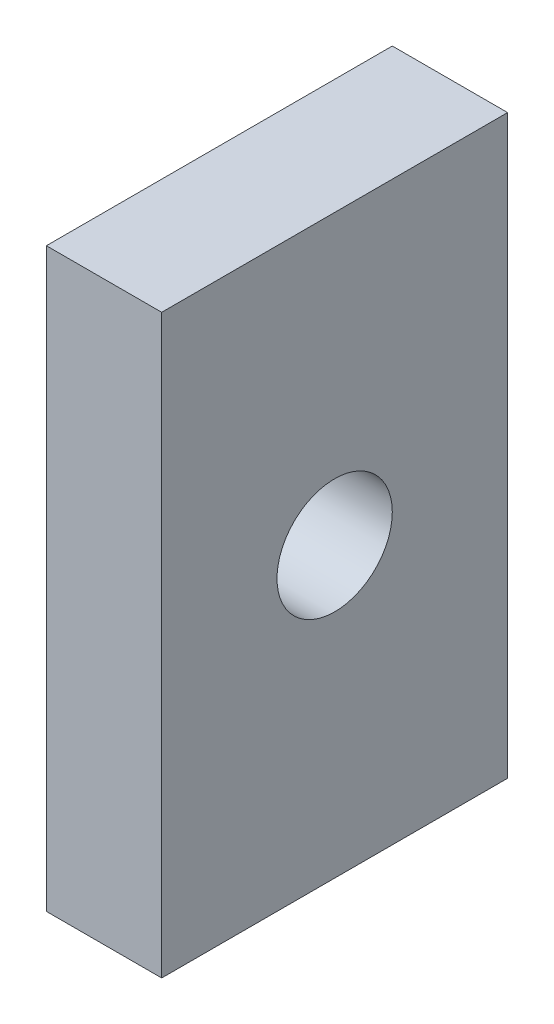
ISO-10303-21;
HEADER;
FILE_DESCRIPTION(('STEP AP214'),'2;1');
FILE_NAME('part.step','',(''),(''),'','','');
FILE_SCHEMA(('AUTOMOTIVE_DESIGN { 1 0 10303 214 1 1 1 1 }'));
ENDSEC;
DATA;
#1=APPLICATION_CONTEXT('core data for automotive mechanical design processes');
#2=APPLICATION_PROTOCOL_DEFINITION('international standard','automotive_design',2000,#1);
#3=PRODUCT_CONTEXT('',#1,'mechanical');
#4=PRODUCT('Part','Part','',(#3));
#5=PRODUCT_RELATED_PRODUCT_CATEGORY('part','',(#4));
#6=PRODUCT_DEFINITION_FORMATION('','',#4);
#7=PRODUCT_DEFINITION_CONTEXT('part definition',#1,'design');
#8=PRODUCT_DEFINITION('design','',#6,#7);
#9=PRODUCT_DEFINITION_SHAPE('','',#8);
#10=(LENGTH_UNIT() NAMED_UNIT(*) SI_UNIT(.MILLI.,.METRE.));
#11=(NAMED_UNIT(*) PLANE_ANGLE_UNIT() SI_UNIT($,.RADIAN.));
#12=(NAMED_UNIT(*) SI_UNIT($,.STERADIAN.) SOLID_ANGLE_UNIT());
#13=UNCERTAINTY_MEASURE_WITH_UNIT(LENGTH_MEASURE(1.E-05),#10,'distance_accuracy_value','');
#14=(GEOMETRIC_REPRESENTATION_CONTEXT(3) GLOBAL_UNCERTAINTY_ASSIGNED_CONTEXT((#13)) GLOBAL_UNIT_ASSIGNED_CONTEXT((#10,
#11,#12)) REPRESENTATION_CONTEXT('',''));
#15=CARTESIAN_POINT('',(0.,0.,0.));
#16=DIRECTION('',(0.,0.,1.));
#17=DIRECTION('',(1.,0.,0.));
#18=AXIS2_PLACEMENT_3D('',#15,#16,#17);
#19=CARTESIAN_POINT('',(10.,25.,-15.));
#20=DIRECTION('',(0.,-1.,0.));
#21=DIRECTION('',(0.,0.,-1.));
#22=AXIS2_PLACEMENT_3D('',#19,#20,#21);
#23=PLANE('',#22);
#24=DIRECTION('',(0.,0.,1.));
#25=VECTOR('',#24,1.);
#26=CARTESIAN_POINT('',(0.,25.,-15.));
#27=LINE('',#26,#25);
#28=CARTESIAN_POINT('',(0.,25.,-15.));
#29=VERTEX_POINT('',#28);
#30=CARTESIAN_POINT('',(0.,25.,15.));
#31=VERTEX_POINT('',#30);
#32=EDGE_CURVE('E113',#29,#31,#27,.T.);
#33=ORIENTED_EDGE('',*,*,#32,.T.);
#34=DIRECTION('',(-1.,0.,0.));
#35=VECTOR('',#34,1.);
#36=CARTESIAN_POINT('',(10.,25.,15.));
#37=LINE('',#36,#35);
#38=CARTESIAN_POINT('',(10.,25.,15.));
#39=VERTEX_POINT('',#38);
#40=EDGE_CURVE('E11',#39,#31,#37,.T.);
#41=ORIENTED_EDGE('',*,*,#40,.F.);
#42=DIRECTION('',(0.,0.,1.));
#43=VECTOR('',#42,1.);
#44=CARTESIAN_POINT('',(10.,25.,-15.));
#45=LINE('',#44,#43);
#46=CARTESIAN_POINT('',(10.,25.,-15.));
#47=VERTEX_POINT('',#46);
#48=EDGE_CURVE('E97',#47,#39,#45,.T.);
#49=ORIENTED_EDGE('',*,*,#48,.F.);
#50=DIRECTION('',(-1.,0.,0.));
#51=VECTOR('',#50,1.);
#52=CARTESIAN_POINT('',(10.,25.,-15.));
#53=LINE('',#52,#51);
#54=EDGE_CURVE('E109',#47,#29,#53,.T.);
#55=ORIENTED_EDGE('',*,*,#54,.T.);
#56=EDGE_LOOP('',(#33,#41,#49,#55));
#57=FACE_BOUND('',#56,.T.);
#58=ADVANCED_FACE('F45',(#57),#23,.F.);
#59=CARTESIAN_POINT('',(10.,-25.,15.));
#60=DIRECTION('',(0.,0.,-1.));
#61=DIRECTION('',(-1.,0.,0.));
#62=AXIS2_PLACEMENT_3D('',#59,#60,#61);
#63=PLANE('',#62);
#64=DIRECTION('',(0.,-1.,0.));
#65=VECTOR('',#64,1.);
#66=CARTESIAN_POINT('',(0.,-25.,15.));
#67=LINE('',#66,#65);
#68=CARTESIAN_POINT('',(0.,-25.,15.));
#69=VERTEX_POINT('',#68);
#70=EDGE_CURVE('E102',#31,#69,#67,.T.);
#71=ORIENTED_EDGE('',*,*,#70,.T.);
#72=DIRECTION('',(-1.,0.,0.));
#73=VECTOR('',#72,1.);
#74=CARTESIAN_POINT('',(10.,-25.,15.));
#75=LINE('',#74,#73);
#76=CARTESIAN_POINT('',(10.,-25.,15.));
#77=VERTEX_POINT('',#76);
#78=EDGE_CURVE('E54',#77,#69,#75,.T.);
#79=ORIENTED_EDGE('',*,*,#78,.F.);
#80=DIRECTION('',(0.,-1.,0.));
#81=VECTOR('',#80,1.);
#82=CARTESIAN_POINT('',(10.,-25.,15.));
#83=LINE('',#82,#81);
#84=EDGE_CURVE('E92',#39,#77,#83,.T.);
#85=ORIENTED_EDGE('',*,*,#84,.F.);
#86=ORIENTED_EDGE('',*,*,#40,.T.);
#87=EDGE_LOOP('',(#71,#79,#85,#86));
#88=FACE_BOUND('',#87,.T.);
#89=ADVANCED_FACE('F101',(#88),#63,.F.);
#90=CARTESIAN_POINT('',(10.,-25.,-15.));
#91=DIRECTION('',(0.,1.,0.));
#92=DIRECTION('',(0.,0.,1.));
#93=AXIS2_PLACEMENT_3D('',#90,#91,#92);
#94=PLANE('',#93);
#95=DIRECTION('',(0.,0.,-1.));
#96=VECTOR('',#95,1.);
#97=CARTESIAN_POINT('',(0.,-25.,-15.));
#98=LINE('',#97,#96);
#99=CARTESIAN_POINT('',(0.,-25.,-15.));
#100=VERTEX_POINT('',#99);
#101=EDGE_CURVE('E79',#69,#100,#98,.T.);
#102=ORIENTED_EDGE('',*,*,#101,.T.);
#103=DIRECTION('',(-1.,0.,0.));
#104=VECTOR('',#103,1.);
#105=CARTESIAN_POINT('',(10.,-25.,-15.));
#106=LINE('',#105,#104);
#107=CARTESIAN_POINT('',(10.,-25.,-15.));
#108=VERTEX_POINT('',#107);
#109=EDGE_CURVE('E104',#108,#100,#106,.T.);
#110=ORIENTED_EDGE('',*,*,#109,.F.);
#111=DIRECTION('',(0.,0.,-1.));
#112=VECTOR('',#111,1.);
#113=CARTESIAN_POINT('',(10.,-25.,-15.));
#114=LINE('',#113,#112);
#115=EDGE_CURVE('E95',#77,#108,#114,.T.);
#116=ORIENTED_EDGE('',*,*,#115,.F.);
#117=ORIENTED_EDGE('',*,*,#78,.T.);
#118=EDGE_LOOP('',(#102,#110,#116,#117));
#119=FACE_BOUND('',#118,.T.);
#120=ADVANCED_FACE('F105',(#119),#94,.F.);
#121=CARTESIAN_POINT('',(10.,-25.,-15.));
#122=DIRECTION('',(0.,0.,1.));
#123=DIRECTION('',(1.,0.,0.));
#124=AXIS2_PLACEMENT_3D('',#121,#122,#123);
#125=PLANE('',#124);
#126=DIRECTION('',(0.,1.,0.));
#127=VECTOR('',#126,1.);
#128=CARTESIAN_POINT('',(0.,-25.,-15.));
#129=LINE('',#128,#127);
#130=EDGE_CURVE('E85',#100,#29,#129,.T.);
#131=ORIENTED_EDGE('',*,*,#130,.T.);
#132=ORIENTED_EDGE('',*,*,#54,.F.);
#133=DIRECTION('',(0.,1.,0.));
#134=VECTOR('',#133,1.);
#135=CARTESIAN_POINT('',(10.,-25.,-15.));
#136=LINE('',#135,#134);
#137=EDGE_CURVE('E62',#108,#47,#136,.T.);
#138=ORIENTED_EDGE('',*,*,#137,.F.);
#139=ORIENTED_EDGE('',*,*,#109,.T.);
#140=EDGE_LOOP('',(#131,#132,#138,#139));
#141=FACE_BOUND('',#140,.T.);
#142=ADVANCED_FACE('F127',(#141),#125,.F.);
#143=CARTESIAN_POINT('',(10.,0.,0.));
#144=DIRECTION('',(-1.,0.,0.));
#145=DIRECTION('',(0.,0.,1.));
#146=AXIS2_PLACEMENT_3D('',#143,#144,#145);
#147=PLANE('',#146);
#148=CARTESIAN_POINT('',(10.,0.,0.));
#149=DIRECTION('',(1.,0.,0.));
#150=DIRECTION('',(0.,0.,-1.));
#151=AXIS2_PLACEMENT_3D('',#148,#149,#150);
#152=CIRCLE('',#151,5.);
#153=CARTESIAN_POINT('',(10.,0.,-5.));
#154=VERTEX_POINT('',#153);
#155=EDGE_CURVE('E134',#154,#154,#152,.T.);
#156=ORIENTED_EDGE('',*,*,#155,.F.);
#157=EDGE_LOOP('',(#156));
#158=FACE_BOUND('',#157,.T.);
#159=ORIENTED_EDGE('',*,*,#48,.T.);
#160=ORIENTED_EDGE('',*,*,#84,.T.);
#161=ORIENTED_EDGE('',*,*,#115,.T.);
#162=ORIENTED_EDGE('',*,*,#137,.T.);
#163=EDGE_LOOP('',(#159,#160,#161,#162));
#164=FACE_BOUND('',#163,.T.);
#165=ADVANCED_FACE('F93',(#158,#164),#147,.F.);
#166=CARTESIAN_POINT('',(0.,0.,0.));
#167=DIRECTION('',(-1.,0.,0.));
#168=DIRECTION('',(0.,0.,1.));
#169=AXIS2_PLACEMENT_3D('',#166,#167,#168);
#170=PLANE('',#169);
#171=CARTESIAN_POINT('',(0.,0.,0.));
#172=DIRECTION('',(1.,0.,0.));
#173=DIRECTION('',(0.,0.,-1.));
#174=AXIS2_PLACEMENT_3D('',#171,#172,#173);
#175=CIRCLE('',#174,5.);
#176=CARTESIAN_POINT('',(0.,0.,-5.));
#177=VERTEX_POINT('',#176);
#178=EDGE_CURVE('E117',#177,#177,#175,.T.);
#179=ORIENTED_EDGE('',*,*,#178,.T.);
#180=EDGE_LOOP('',(#179));
#181=FACE_BOUND('',#180,.T.);
#182=ORIENTED_EDGE('',*,*,#32,.F.);
#183=ORIENTED_EDGE('',*,*,#130,.F.);
#184=ORIENTED_EDGE('',*,*,#101,.F.);
#185=ORIENTED_EDGE('',*,*,#70,.F.);
#186=EDGE_LOOP('',(#182,#183,#184,#185));
#187=FACE_BOUND('',#186,.T.);
#188=ADVANCED_FACE('F130',(#181,#187),#170,.T.);
#189=CARTESIAN_POINT('',(0.,0.,0.));
#190=DIRECTION('',(1.,0.,0.));
#191=DIRECTION('',(0.,0.,-1.));
#192=AXIS2_PLACEMENT_3D('',#189,#190,#191);
#193=CYLINDRICAL_SURFACE('',#192,5.);
#194=ORIENTED_EDGE('',*,*,#178,.F.);
#195=EDGE_LOOP('',(#194));
#196=FACE_BOUND('',#195,.T.);
#197=ORIENTED_EDGE('',*,*,#155,.T.);
#198=EDGE_LOOP('',(#197));
#199=FACE_BOUND('',#198,.T.);
#200=ADVANCED_FACE('F143',(#196,#199),#193,.F.);
#201=CLOSED_SHELL('',(#58,#89,#120,#142,#165,#188,#200));
#202=MANIFOLD_SOLID_BREP('B2',#201);
#203=ADVANCED_BREP_SHAPE_REPRESENTATION('',(#18,#202),#14);
#204=SHAPE_DEFINITION_REPRESENTATION(#9,#203);
ENDSEC;
END-ISO-10303-21;
